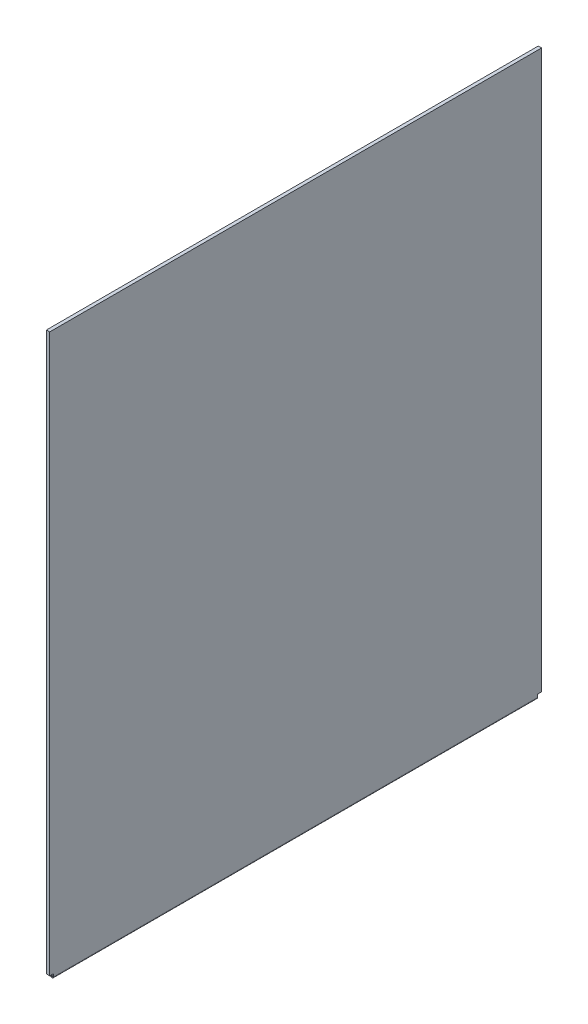
ISO-10303-21;
HEADER;
FILE_DESCRIPTION(('STEP AP214'),'2;1');
FILE_NAME('part.step','',(''),(''),'','','');
FILE_SCHEMA(('AUTOMOTIVE_DESIGN { 1 0 10303 214 1 1 1 1 }'));
ENDSEC;
DATA;
#1=APPLICATION_CONTEXT('core data for automotive mechanical design processes');
#2=APPLICATION_PROTOCOL_DEFINITION('international standard','automotive_design',2000,#1);
#3=PRODUCT_CONTEXT('',#1,'mechanical');
#4=PRODUCT('Part','Part','',(#3));
#5=PRODUCT_RELATED_PRODUCT_CATEGORY('part','',(#4));
#6=PRODUCT_DEFINITION_FORMATION('','',#4);
#7=PRODUCT_DEFINITION_CONTEXT('part definition',#1,'design');
#8=PRODUCT_DEFINITION('design','',#6,#7);
#9=PRODUCT_DEFINITION_SHAPE('','',#8);
#10=(LENGTH_UNIT() NAMED_UNIT(*) SI_UNIT(.MILLI.,.METRE.));
#11=(NAMED_UNIT(*) PLANE_ANGLE_UNIT() SI_UNIT($,.RADIAN.));
#12=(NAMED_UNIT(*) SI_UNIT($,.STERADIAN.) SOLID_ANGLE_UNIT());
#13=UNCERTAINTY_MEASURE_WITH_UNIT(LENGTH_MEASURE(1.E-05),#10,'distance_accuracy_value','');
#14=(GEOMETRIC_REPRESENTATION_CONTEXT(3) GLOBAL_UNCERTAINTY_ASSIGNED_CONTEXT((#13)) GLOBAL_UNIT_ASSIGNED_CONTEXT((#10,
#11,#12)) REPRESENTATION_CONTEXT('',''));
#15=CARTESIAN_POINT('',(0.,0.,0.));
#16=DIRECTION('',(0.,0.,1.));
#17=DIRECTION('',(1.,0.,0.));
#18=AXIS2_PLACEMENT_3D('',#15,#16,#17);
#19=CARTESIAN_POINT('',(2.4,-404.,355.6));
#20=DIRECTION('',(0.,0.,-1.));
#21=DIRECTION('',(-1.,0.,0.));
#22=AXIS2_PLACEMENT_3D('',#19,#20,#21);
#23=CYLINDRICAL_SURFACE('',#22,2.4);
#24=DIRECTION('',(0.,0.,-1.));
#25=VECTOR('',#24,1.);
#26=CARTESIAN_POINT('',(0.,-404.,0.));
#27=LINE('',#26,#25);
#28=CARTESIAN_POINT('',(0.,-404.,-350.));
#29=VERTEX_POINT('',#28);
#30=CARTESIAN_POINT('',(0.,-404.,350.));
#31=VERTEX_POINT('',#30);
#32=EDGE_CURVE('E54',#29,#31,#27,.F.);
#33=ORIENTED_EDGE('',*,*,#32,.F.);
#34=CARTESIAN_POINT('',(2.4,-404.,-350.));
#35=DIRECTION('',(0.,0.,1.));
#36=DIRECTION('',(1.,0.,0.));
#37=AXIS2_PLACEMENT_3D('',#34,#35,#36);
#38=CIRCLE('',#37,2.4);
#39=CARTESIAN_POINT('',(2.4,-406.4,-350.));
#40=VERTEX_POINT('',#39);
#41=EDGE_CURVE('E62',#29,#40,#38,.T.);
#42=ORIENTED_EDGE('',*,*,#41,.T.);
#43=DIRECTION('',(0.,0.,-1.));
#44=VECTOR('',#43,1.);
#45=CARTESIAN_POINT('',(2.4,-406.4,355.6));
#46=LINE('',#45,#44);
#47=CARTESIAN_POINT('',(2.4,-406.4,350.));
#48=VERTEX_POINT('',#47);
#49=EDGE_CURVE('E178',#48,#40,#46,.T.);
#50=ORIENTED_EDGE('',*,*,#49,.F.);
#51=CARTESIAN_POINT('',(2.4,-404.,350.));
#52=DIRECTION('',(0.,0.,1.));
#53=DIRECTION('',(1.,0.,0.));
#54=AXIS2_PLACEMENT_3D('',#51,#52,#53);
#55=CIRCLE('',#54,2.4);
#56=EDGE_CURVE('E70',#31,#48,#55,.T.);
#57=ORIENTED_EDGE('',*,*,#56,.F.);
#58=EDGE_LOOP('',(#33,#42,#50,#57));
#59=FACE_BOUND('',#58,.T.);
#60=ADVANCED_FACE('F45',(#59),#23,.T.);
#61=CARTESIAN_POINT('',(2.4,-404.,0.));
#62=DIRECTION('',(0.,0.,1.));
#63=DIRECTION('',(1.,0.,0.));
#64=AXIS2_PLACEMENT_3D('',#61,#62,#63);
#65=CYLINDRICAL_SURFACE('',#64,2.4);
#66=ORIENTED_EDGE('',*,*,#49,.T.);
#67=CARTESIAN_POINT('',(4.80000000000001,-404.,-350.));
#68=VERTEX_POINT('',#67);
#69=EDGE_CURVE('E145',#40,#68,#38,.T.);
#70=ORIENTED_EDGE('',*,*,#69,.T.);
#71=DIRECTION('',(0.,0.,-1.));
#72=VECTOR('',#71,1.);
#73=CARTESIAN_POINT('',(4.8,-404.,-355.6));
#74=LINE('',#73,#72);
#75=CARTESIAN_POINT('',(4.80000000000001,-404.,350.));
#76=VERTEX_POINT('',#75);
#77=EDGE_CURVE('E208',#76,#68,#74,.T.);
#78=ORIENTED_EDGE('',*,*,#77,.F.);
#79=CARTESIAN_POINT('',(2.4,-404.,350.));
#80=DIRECTION('',(0.,0.,1.));
#81=DIRECTION('',(1.,0.,0.));
#82=AXIS2_PLACEMENT_3D('',#79,#80,#81);
#83=CIRCLE('',#82,2.4);
#84=EDGE_CURVE('E11',#76,#48,#83,.F.);
#85=ORIENTED_EDGE('',*,*,#84,.T.);
#86=EDGE_LOOP('',(#66,#70,#78,#85));
#87=FACE_BOUND('',#86,.T.);
#88=ADVANCED_FACE('F233',(#87),#65,.T.);
#89=CARTESIAN_POINT('',(4.8,406.4,-355.6));
#90=DIRECTION('',(0.,0.,1.));
#91=DIRECTION('',(0.,-1.,0.));
#92=AXIS2_PLACEMENT_3D('',#89,#90,#91);
#93=PLANE('',#92);
#94=DIRECTION('',(-1.,0.,0.));
#95=VECTOR('',#94,1.);
#96=CARTESIAN_POINT('',(0.,-400.,-355.6));
#97=LINE('',#96,#95);
#98=CARTESIAN_POINT('',(4.8,-400.,-355.6));
#99=VERTEX_POINT('',#98);
#100=CARTESIAN_POINT('',(0.,-400.,-355.6));
#101=VERTEX_POINT('',#100);
#102=EDGE_CURVE('E134',#99,#101,#97,.T.);
#103=ORIENTED_EDGE('',*,*,#102,.T.);
#104=DIRECTION('',(0.,1.,0.));
#105=VECTOR('',#104,1.);
#106=CARTESIAN_POINT('',(0.,406.4,-355.6));
#107=LINE('',#106,#105);
#108=CARTESIAN_POINT('',(0.,406.4,-355.6));
#109=VERTEX_POINT('',#108);
#110=EDGE_CURVE('E139',#101,#109,#107,.T.);
#111=ORIENTED_EDGE('',*,*,#110,.T.);
#112=DIRECTION('',(-1.,0.,0.));
#113=VECTOR('',#112,1.);
#114=CARTESIAN_POINT('',(4.8,406.4,-355.6));
#115=LINE('',#114,#113);
#116=CARTESIAN_POINT('',(4.8,406.4,-355.6));
#117=VERTEX_POINT('',#116);
#118=EDGE_CURVE('E204',#117,#109,#115,.T.);
#119=ORIENTED_EDGE('',*,*,#118,.F.);
#120=DIRECTION('',(0.,1.,0.));
#121=VECTOR('',#120,1.);
#122=CARTESIAN_POINT('',(4.8,406.4,-355.6));
#123=LINE('',#122,#121);
#124=EDGE_CURVE('E181',#99,#117,#123,.T.);
#125=ORIENTED_EDGE('',*,*,#124,.F.);
#126=EDGE_LOOP('',(#103,#111,#119,#125));
#127=FACE_BOUND('',#126,.T.);
#128=ADVANCED_FACE('F252',(#127),#93,.F.);
#129=CARTESIAN_POINT('',(4.8,0.,0.));
#130=DIRECTION('',(1.,0.,0.));
#131=DIRECTION('',(0.,0.,-1.));
#132=AXIS2_PLACEMENT_3D('',#129,#130,#131);
#133=PLANE('',#132);
#134=DIRECTION('',(0.,1.,0.));
#135=VECTOR('',#134,1.);
#136=CARTESIAN_POINT('',(4.8,-400.,-350.));
#137=LINE('',#136,#135);
#138=CARTESIAN_POINT('',(4.8,-400.,-350.));
#139=VERTEX_POINT('',#138);
#140=EDGE_CURVE('E127',#68,#139,#137,.T.);
#141=ORIENTED_EDGE('',*,*,#140,.T.);
#142=DIRECTION('',(0.,0.,-1.));
#143=VECTOR('',#142,1.);
#144=CARTESIAN_POINT('',(4.8,-400.,-350.));
#145=LINE('',#144,#143);
#146=EDGE_CURVE('E124',#139,#99,#145,.T.);
#147=ORIENTED_EDGE('',*,*,#146,.T.);
#148=ORIENTED_EDGE('',*,*,#124,.T.);
#149=DIRECTION('',(0.,0.,1.));
#150=VECTOR('',#149,1.);
#151=CARTESIAN_POINT('',(4.8,406.4,355.6));
#152=LINE('',#151,#150);
#153=CARTESIAN_POINT('',(4.8,406.4,355.6));
#154=VERTEX_POINT('',#153);
#155=EDGE_CURVE('E184',#117,#154,#152,.T.);
#156=ORIENTED_EDGE('',*,*,#155,.T.);
#157=DIRECTION('',(0.,-1.,0.));
#158=VECTOR('',#157,1.);
#159=CARTESIAN_POINT('',(4.8,406.4,355.6));
#160=LINE('',#159,#158);
#161=CARTESIAN_POINT('',(4.8,-400.,355.6));
#162=VERTEX_POINT('',#161);
#163=EDGE_CURVE('E188',#154,#162,#160,.T.);
#164=ORIENTED_EDGE('',*,*,#163,.T.);
#165=DIRECTION('',(0.,0.,1.));
#166=VECTOR('',#165,1.);
#167=CARTESIAN_POINT('',(4.8,-400.,350.));
#168=LINE('',#167,#166);
#169=CARTESIAN_POINT('',(4.8,-400.,350.));
#170=VERTEX_POINT('',#169);
#171=EDGE_CURVE('E171',#170,#162,#168,.T.);
#172=ORIENTED_EDGE('',*,*,#171,.F.);
#173=DIRECTION('',(0.,1.,0.));
#174=VECTOR('',#173,1.);
#175=CARTESIAN_POINT('',(4.8,-400.,350.));
#176=LINE('',#175,#174);
#177=EDGE_CURVE('E164',#76,#170,#176,.T.);
#178=ORIENTED_EDGE('',*,*,#177,.F.);
#179=ORIENTED_EDGE('',*,*,#77,.T.);
#180=EDGE_LOOP('',(#141,#147,#148,#156,#164,#172,#178,#179));
#181=FACE_BOUND('',#180,.T.);
#182=ADVANCED_FACE('F238',(#181),#133,.T.);
#183=CARTESIAN_POINT('',(0.,0.,0.));
#184=DIRECTION('',(1.,0.,0.));
#185=DIRECTION('',(0.,0.,-1.));
#186=AXIS2_PLACEMENT_3D('',#183,#184,#185);
#187=PLANE('',#186);
#188=DIRECTION('',(0.,0.,-1.));
#189=VECTOR('',#188,1.);
#190=CARTESIAN_POINT('',(0.,-400.,-350.));
#191=LINE('',#190,#189);
#192=CARTESIAN_POINT('',(0.,-400.,-350.));
#193=VERTEX_POINT('',#192);
#194=EDGE_CURVE('E121',#193,#101,#191,.T.);
#195=ORIENTED_EDGE('',*,*,#194,.F.);
#196=DIRECTION('',(0.,-1.,0.));
#197=VECTOR('',#196,1.);
#198=CARTESIAN_POINT('',(0.,-400.,-350.));
#199=LINE('',#198,#197);
#200=EDGE_CURVE('E128',#193,#29,#199,.T.);
#201=ORIENTED_EDGE('',*,*,#200,.T.);
#202=ORIENTED_EDGE('',*,*,#32,.T.);
#203=DIRECTION('',(0.,-1.,0.));
#204=VECTOR('',#203,1.);
#205=CARTESIAN_POINT('',(0.,-400.,350.));
#206=LINE('',#205,#204);
#207=CARTESIAN_POINT('',(0.,-400.,350.));
#208=VERTEX_POINT('',#207);
#209=EDGE_CURVE('E158',#208,#31,#206,.T.);
#210=ORIENTED_EDGE('',*,*,#209,.F.);
#211=DIRECTION('',(0.,0.,1.));
#212=VECTOR('',#211,1.);
#213=CARTESIAN_POINT('',(0.,-400.,350.));
#214=LINE('',#213,#212);
#215=CARTESIAN_POINT('',(0.,-400.,355.6));
#216=VERTEX_POINT('',#215);
#217=EDGE_CURVE('E174',#208,#216,#214,.T.);
#218=ORIENTED_EDGE('',*,*,#217,.T.);
#219=DIRECTION('',(0.,-1.,0.));
#220=VECTOR('',#219,1.);
#221=CARTESIAN_POINT('',(0.,406.4,355.6));
#222=LINE('',#221,#220);
#223=CARTESIAN_POINT('',(0.,406.4,355.6));
#224=VERTEX_POINT('',#223);
#225=EDGE_CURVE('E185',#224,#216,#222,.T.);
#226=ORIENTED_EDGE('',*,*,#225,.F.);
#227=DIRECTION('',(0.,0.,1.));
#228=VECTOR('',#227,1.);
#229=CARTESIAN_POINT('',(0.,406.4,355.6));
#230=LINE('',#229,#228);
#231=EDGE_CURVE('E195',#109,#224,#230,.T.);
#232=ORIENTED_EDGE('',*,*,#231,.F.);
#233=ORIENTED_EDGE('',*,*,#110,.F.);
#234=EDGE_LOOP('',(#195,#201,#202,#210,#218,#226,#232,#233));
#235=FACE_BOUND('',#234,.T.);
#236=ADVANCED_FACE('F137',(#235),#187,.F.);
#237=CARTESIAN_POINT('',(4.8,406.4,355.6));
#238=DIRECTION('',(0.,-1.,0.));
#239=DIRECTION('',(0.,0.,-1.));
#240=AXIS2_PLACEMENT_3D('',#237,#238,#239);
#241=PLANE('',#240);
#242=ORIENTED_EDGE('',*,*,#231,.T.);
#243=DIRECTION('',(-1.,0.,0.));
#244=VECTOR('',#243,1.);
#245=CARTESIAN_POINT('',(4.8,406.4,355.6));
#246=LINE('',#245,#244);
#247=EDGE_CURVE('E192',#154,#224,#246,.T.);
#248=ORIENTED_EDGE('',*,*,#247,.F.);
#249=ORIENTED_EDGE('',*,*,#155,.F.);
#250=ORIENTED_EDGE('',*,*,#118,.T.);
#251=EDGE_LOOP('',(#242,#248,#249,#250));
#252=FACE_BOUND('',#251,.T.);
#253=ADVANCED_FACE('F249',(#252),#241,.F.);
#254=CARTESIAN_POINT('',(4.8,406.4,355.6));
#255=DIRECTION('',(0.,0.,-1.));
#256=DIRECTION('',(0.,1.,0.));
#257=AXIS2_PLACEMENT_3D('',#254,#255,#256);
#258=PLANE('',#257);
#259=ORIENTED_EDGE('',*,*,#225,.T.);
#260=DIRECTION('',(-1.,0.,0.));
#261=VECTOR('',#260,1.);
#262=CARTESIAN_POINT('',(0.,-400.,355.6));
#263=LINE('',#262,#261);
#264=EDGE_CURVE('E161',#162,#216,#263,.T.);
#265=ORIENTED_EDGE('',*,*,#264,.F.);
#266=ORIENTED_EDGE('',*,*,#163,.F.);
#267=ORIENTED_EDGE('',*,*,#247,.T.);
#268=EDGE_LOOP('',(#259,#265,#266,#267));
#269=FACE_BOUND('',#268,.T.);
#270=ADVANCED_FACE('F243',(#269),#258,.F.);
#271=CARTESIAN_POINT('',(0.,-400.,350.));
#272=DIRECTION('',(0.,1.,0.));
#273=DIRECTION('',(0.,0.,1.));
#274=AXIS2_PLACEMENT_3D('',#271,#272,#273);
#275=PLANE('',#274);
#276=ORIENTED_EDGE('',*,*,#264,.T.);
#277=ORIENTED_EDGE('',*,*,#217,.F.);
#278=DIRECTION('',(-1.,0.,0.));
#279=VECTOR('',#278,1.);
#280=CARTESIAN_POINT('',(0.,-400.,350.));
#281=LINE('',#280,#279);
#282=EDGE_CURVE('E167',#170,#208,#281,.T.);
#283=ORIENTED_EDGE('',*,*,#282,.F.);
#284=ORIENTED_EDGE('',*,*,#171,.T.);
#285=EDGE_LOOP('',(#276,#277,#283,#284));
#286=FACE_BOUND('',#285,.T.);
#287=ADVANCED_FACE('F225',(#286),#275,.F.);
#288=CARTESIAN_POINT('',(2.4,-404.,350.));
#289=DIRECTION('',(0.,0.,1.));
#290=DIRECTION('',(1.,0.,0.));
#291=AXIS2_PLACEMENT_3D('',#288,#289,#290);
#292=PLANE('',#291);
#293=CARTESIAN_POINT('',(2.4,-404.,350.));
#294=DIRECTION('',(0.,0.,1.));
#295=DIRECTION('',(1.,0.,0.));
#296=AXIS2_PLACEMENT_3D('',#293,#294,#295);
#297=CIRCLE('',#296,1.);
#298=CARTESIAN_POINT('',(3.4,-404.,350.));
#299=VERTEX_POINT('',#298);
#300=EDGE_CURVE('E157',#299,#299,#297,.T.);
#301=ORIENTED_EDGE('',*,*,#300,.F.);
#302=EDGE_LOOP('',(#301));
#303=FACE_BOUND('',#302,.T.);
#304=ORIENTED_EDGE('',*,*,#209,.T.);
#305=ORIENTED_EDGE('',*,*,#56,.T.);
#306=ORIENTED_EDGE('',*,*,#84,.F.);
#307=ORIENTED_EDGE('',*,*,#177,.T.);
#308=ORIENTED_EDGE('',*,*,#282,.T.);
#309=EDGE_LOOP('',(#304,#305,#306,#307,#308));
#310=FACE_BOUND('',#309,.T.);
#311=ADVANCED_FACE('F223',(#303,#310),#292,.T.);
#312=CARTESIAN_POINT('',(2.4,-404.,345.6));
#313=DIRECTION('',(0.,0.,1.));
#314=DIRECTION('',(1.,0.,0.));
#315=AXIS2_PLACEMENT_3D('',#312,#313,#314);
#316=CYLINDRICAL_SURFACE('',#315,1.);
#317=ORIENTED_EDGE('',*,*,#300,.T.);
#318=EDGE_LOOP('',(#317));
#319=FACE_BOUND('',#318,.T.);
#320=CARTESIAN_POINT('',(2.4,-404.,345.6));
#321=DIRECTION('',(0.,0.,1.));
#322=DIRECTION('',(1.,0.,0.));
#323=AXIS2_PLACEMENT_3D('',#320,#321,#322);
#324=CIRCLE('',#323,1.);
#325=CARTESIAN_POINT('',(3.4,-404.,345.6));
#326=VERTEX_POINT('',#325);
#327=EDGE_CURVE('E153',#326,#326,#324,.T.);
#328=ORIENTED_EDGE('',*,*,#327,.F.);
#329=EDGE_LOOP('',(#328));
#330=FACE_BOUND('',#329,.T.);
#331=ADVANCED_FACE('F220',(#319,#330),#316,.F.);
#332=CARTESIAN_POINT('',(2.4,-404.,345.6));
#333=DIRECTION('',(0.,0.,1.));
#334=DIRECTION('',(1.,0.,0.));
#335=AXIS2_PLACEMENT_3D('',#332,#333,#334);
#336=PLANE('',#335);
#337=ORIENTED_EDGE('',*,*,#327,.T.);
#338=EDGE_LOOP('',(#337));
#339=FACE_BOUND('',#338,.T.);
#340=ADVANCED_FACE('F316',(#339),#336,.T.);
#341=CARTESIAN_POINT('',(0.,-400.,-350.));
#342=DIRECTION('',(0.,-1.,0.));
#343=DIRECTION('',(0.,0.,-1.));
#344=AXIS2_PLACEMENT_3D('',#341,#342,#343);
#345=PLANE('',#344);
#346=ORIENTED_EDGE('',*,*,#102,.F.);
#347=ORIENTED_EDGE('',*,*,#146,.F.);
#348=DIRECTION('',(-1.,0.,0.));
#349=VECTOR('',#348,1.);
#350=CARTESIAN_POINT('',(0.,-400.,-350.));
#351=LINE('',#350,#349);
#352=EDGE_CURVE('E118',#139,#193,#351,.T.);
#353=ORIENTED_EDGE('',*,*,#352,.T.);
#354=ORIENTED_EDGE('',*,*,#194,.T.);
#355=EDGE_LOOP('',(#346,#347,#353,#354));
#356=FACE_BOUND('',#355,.T.);
#357=ADVANCED_FACE('F119',(#356),#345,.T.);
#358=CARTESIAN_POINT('',(2.4,-404.,-350.));
#359=DIRECTION('',(0.,0.,-1.));
#360=DIRECTION('',(1.,0.,0.));
#361=AXIS2_PLACEMENT_3D('',#358,#359,#360);
#362=PLANE('',#361);
#363=CARTESIAN_POINT('',(2.4,-404.,-350.));
#364=DIRECTION('',(0.,0.,-1.));
#365=DIRECTION('',(-1.,0.,0.));
#366=AXIS2_PLACEMENT_3D('',#363,#364,#365);
#367=CIRCLE('',#366,1.);
#368=CARTESIAN_POINT('',(1.4,-404.,-350.));
#369=VERTEX_POINT('',#368);
#370=EDGE_CURVE('E48',#369,#369,#367,.T.);
#371=ORIENTED_EDGE('',*,*,#370,.F.);
#372=EDGE_LOOP('',(#371));
#373=FACE_BOUND('',#372,.T.);
#374=ORIENTED_EDGE('',*,*,#200,.F.);
#375=ORIENTED_EDGE('',*,*,#352,.F.);
#376=ORIENTED_EDGE('',*,*,#140,.F.);
#377=ORIENTED_EDGE('',*,*,#69,.F.);
#378=ORIENTED_EDGE('',*,*,#41,.F.);
#379=EDGE_LOOP('',(#374,#375,#376,#377,#378));
#380=FACE_BOUND('',#379,.T.);
#381=ADVANCED_FACE('F130',(#373,#380),#362,.T.);
#382=CARTESIAN_POINT('',(2.4,-404.,-345.6));
#383=DIRECTION('',(0.,0.,-1.));
#384=DIRECTION('',(1.,0.,0.));
#385=AXIS2_PLACEMENT_3D('',#382,#383,#384);
#386=PLANE('',#385);
#387=CARTESIAN_POINT('',(2.4,-404.,-345.6));
#388=DIRECTION('',(0.,0.,1.));
#389=DIRECTION('',(1.,0.,0.));
#390=AXIS2_PLACEMENT_3D('',#387,#388,#389);
#391=CIRCLE('',#390,1.);
#392=CARTESIAN_POINT('',(3.4,-404.,-345.6));
#393=VERTEX_POINT('',#392);
#394=EDGE_CURVE('E149',#393,#393,#391,.T.);
#395=ORIENTED_EDGE('',*,*,#394,.F.);
#396=EDGE_LOOP('',(#395));
#397=FACE_BOUND('',#396,.T.);
#398=ADVANCED_FACE('F274',(#397),#386,.T.);
#399=CARTESIAN_POINT('',(2.4,-404.,-345.6));
#400=DIRECTION('',(0.,0.,-1.));
#401=DIRECTION('',(-1.,0.,0.));
#402=AXIS2_PLACEMENT_3D('',#399,#400,#401);
#403=CYLINDRICAL_SURFACE('',#402,1.);
#404=ORIENTED_EDGE('',*,*,#394,.T.);
#405=EDGE_LOOP('',(#404));
#406=FACE_BOUND('',#405,.T.);
#407=ORIENTED_EDGE('',*,*,#370,.T.);
#408=EDGE_LOOP('',(#407));
#409=FACE_BOUND('',#408,.T.);
#410=ADVANCED_FACE('F301',(#406,#409),#403,.F.);
#411=CLOSED_SHELL('',(#60,#88,#128,#182,#236,#253,#270,#287,#311,#331,#340,#357,#381,#398,#410));
#412=MANIFOLD_SOLID_BREP('B2',#411);
#413=ADVANCED_BREP_SHAPE_REPRESENTATION('',(#18,#412),#14);
#414=SHAPE_DEFINITION_REPRESENTATION(#9,#413);
ENDSEC;
END-ISO-10303-21;
